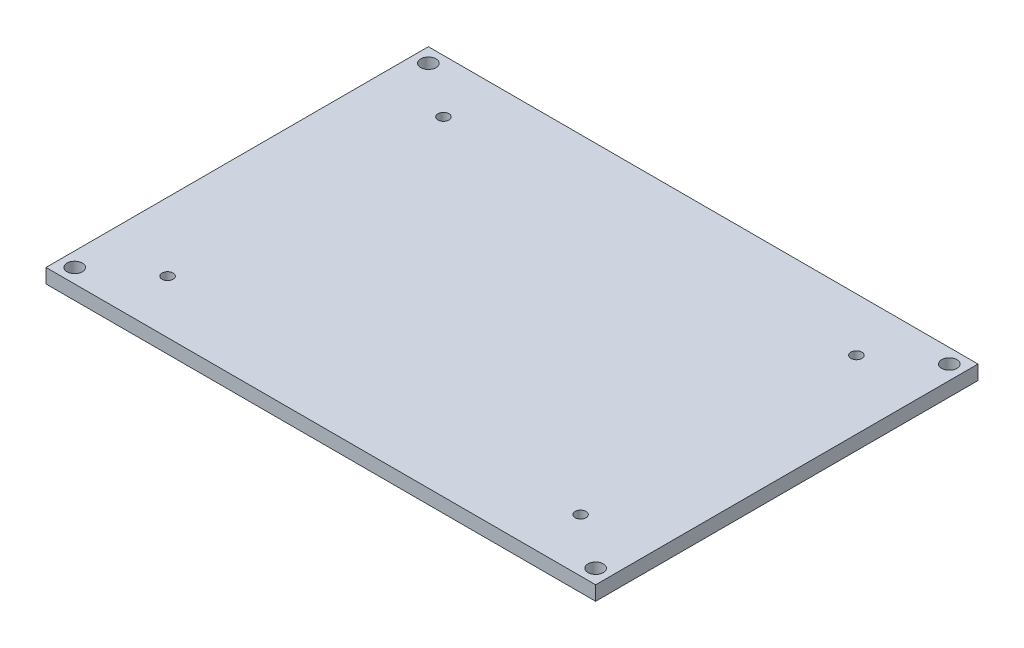
ISO-10303-21;
HEADER;
FILE_DESCRIPTION(('STEP AP214'),'2;1');
FILE_NAME('part.step','',(''),(''),'','','');
FILE_SCHEMA(('AUTOMOTIVE_DESIGN { 1 0 10303 214 1 1 1 1 }'));
ENDSEC;
DATA;
#1=APPLICATION_CONTEXT('core data for automotive mechanical design processes');
#2=APPLICATION_PROTOCOL_DEFINITION('international standard','automotive_design',2000,#1);
#3=PRODUCT_CONTEXT('',#1,'mechanical');
#4=PRODUCT('Part','Part','',(#3));
#5=PRODUCT_RELATED_PRODUCT_CATEGORY('part','',(#4));
#6=PRODUCT_DEFINITION_FORMATION('','',#4);
#7=PRODUCT_DEFINITION_CONTEXT('part definition',#1,'design');
#8=PRODUCT_DEFINITION('design','',#6,#7);
#9=PRODUCT_DEFINITION_SHAPE('','',#8);
#10=(LENGTH_UNIT() NAMED_UNIT(*) SI_UNIT(.MILLI.,.METRE.));
#11=(NAMED_UNIT(*) PLANE_ANGLE_UNIT() SI_UNIT($,.RADIAN.));
#12=(NAMED_UNIT(*) SI_UNIT($,.STERADIAN.) SOLID_ANGLE_UNIT());
#13=UNCERTAINTY_MEASURE_WITH_UNIT(LENGTH_MEASURE(1.E-05),#10,'distance_accuracy_value','');
#14=(GEOMETRIC_REPRESENTATION_CONTEXT(3) GLOBAL_UNCERTAINTY_ASSIGNED_CONTEXT((#13)) GLOBAL_UNIT_ASSIGNED_CONTEXT((#10,
#11,#12)) REPRESENTATION_CONTEXT('',''));
#15=CARTESIAN_POINT('',(0.,0.,0.));
#16=DIRECTION('',(0.,0.,1.));
#17=DIRECTION('',(1.,0.,0.));
#18=AXIS2_PLACEMENT_3D('',#15,#16,#17);
#19=CARTESIAN_POINT('',(0.,3.,0.));
#20=DIRECTION('',(0.,-1.,0.));
#21=DIRECTION('',(0.,0.,-1.));
#22=AXIS2_PLACEMENT_3D('',#19,#20,#21);
#23=PLANE('',#22);
#24=DIRECTION('',(0.,0.,-1.));
#25=VECTOR('',#24,1.);
#26=CARTESIAN_POINT('',(57.5,3.,40.));
#27=LINE('',#26,#25);
#28=CARTESIAN_POINT('',(57.5,3.,40.));
#29=VERTEX_POINT('',#28);
#30=CARTESIAN_POINT('',(57.5,3.,-40.));
#31=VERTEX_POINT('',#30);
#32=EDGE_CURVE('E85',#29,#31,#27,.T.);
#33=ORIENTED_EDGE('',*,*,#32,.T.);
#34=DIRECTION('',(-1.,0.,0.));
#35=VECTOR('',#34,1.);
#36=CARTESIAN_POINT('',(-57.5,3.,-40.));
#37=LINE('',#36,#35);
#38=CARTESIAN_POINT('',(-57.5,3.,-40.));
#39=VERTEX_POINT('',#38);
#40=EDGE_CURVE('E80',#31,#39,#37,.T.);
#41=ORIENTED_EDGE('',*,*,#40,.T.);
#42=DIRECTION('',(0.,0.,1.));
#43=VECTOR('',#42,1.);
#44=CARTESIAN_POINT('',(-57.5,3.,40.));
#45=LINE('',#44,#43);
#46=CARTESIAN_POINT('',(-57.5,3.,40.));
#47=VERTEX_POINT('',#46);
#48=EDGE_CURVE('E83',#39,#47,#45,.T.);
#49=ORIENTED_EDGE('',*,*,#48,.T.);
#50=DIRECTION('',(1.,0.,0.));
#51=VECTOR('',#50,1.);
#52=CARTESIAN_POINT('',(-57.5,3.,40.));
#53=LINE('',#52,#51);
#54=EDGE_CURVE('E50',#47,#29,#53,.T.);
#55=ORIENTED_EDGE('',*,*,#54,.T.);
#56=EDGE_LOOP('',(#33,#41,#49,#55));
#57=FACE_BOUND('',#56,.T.);
#58=CARTESIAN_POINT('',(-43.2,3.,-28.86));
#59=DIRECTION('',(0.,1.,0.));
#60=DIRECTION('',(0.,0.,1.));
#61=AXIS2_PLACEMENT_3D('',#58,#59,#60);
#62=CIRCLE('',#61,1.15);
#63=CARTESIAN_POINT('',(-43.2,3.,-27.71));
#64=VERTEX_POINT('',#63);
#65=EDGE_CURVE('E100',#64,#64,#62,.T.);
#66=ORIENTED_EDGE('',*,*,#65,.F.);
#67=EDGE_LOOP('',(#66));
#68=FACE_BOUND('',#67,.T.);
#69=CARTESIAN_POINT('',(43.2,3.,-28.86));
#70=DIRECTION('',(0.,1.,0.));
#71=DIRECTION('',(0.,0.,-1.));
#72=AXIS2_PLACEMENT_3D('',#69,#70,#71);
#73=CIRCLE('',#72,1.15000000000003);
#74=CARTESIAN_POINT('',(43.2,3.,-30.01));
#75=VERTEX_POINT('',#74);
#76=EDGE_CURVE('E115',#75,#75,#73,.T.);
#77=ORIENTED_EDGE('',*,*,#76,.F.);
#78=EDGE_LOOP('',(#77));
#79=FACE_BOUND('',#78,.T.);
#80=CARTESIAN_POINT('',(43.2,3.,28.86));
#81=DIRECTION('',(0.,1.,0.));
#82=DIRECTION('',(0.,0.,1.));
#83=AXIS2_PLACEMENT_3D('',#80,#81,#82);
#84=CIRCLE('',#83,1.1500000000001);
#85=CARTESIAN_POINT('',(43.2,3.,30.0100000000001));
#86=VERTEX_POINT('',#85);
#87=EDGE_CURVE('E121',#86,#86,#84,.T.);
#88=ORIENTED_EDGE('',*,*,#87,.F.);
#89=EDGE_LOOP('',(#88));
#90=FACE_BOUND('',#89,.T.);
#91=CARTESIAN_POINT('',(-43.2,3.,28.86));
#92=DIRECTION('',(0.,1.,0.));
#93=DIRECTION('',(0.,0.,-1.));
#94=AXIS2_PLACEMENT_3D('',#91,#92,#93);
#95=CIRCLE('',#94,1.14999999999999);
#96=CARTESIAN_POINT('',(-43.2,3.,27.71));
#97=VERTEX_POINT('',#96);
#98=EDGE_CURVE('E127',#97,#97,#95,.T.);
#99=ORIENTED_EDGE('',*,*,#98,.F.);
#100=EDGE_LOOP('',(#99));
#101=FACE_BOUND('',#100,.T.);
#102=CARTESIAN_POINT('',(-54.5,3.,-37.));
#103=DIRECTION('',(0.,1.,0.));
#104=DIRECTION('',(0.,0.,1.));
#105=AXIS2_PLACEMENT_3D('',#102,#103,#104);
#106=CIRCLE('',#105,1.6);
#107=CARTESIAN_POINT('',(-54.5,3.,-35.4));
#108=VERTEX_POINT('',#107);
#109=EDGE_CURVE('E133',#108,#108,#106,.T.);
#110=ORIENTED_EDGE('',*,*,#109,.F.);
#111=EDGE_LOOP('',(#110));
#112=FACE_BOUND('',#111,.T.);
#113=CARTESIAN_POINT('',(54.5,3.,-37.));
#114=DIRECTION('',(0.,1.,0.));
#115=DIRECTION('',(0.,0.,-1.));
#116=AXIS2_PLACEMENT_3D('',#113,#114,#115);
#117=CIRCLE('',#116,1.6);
#118=CARTESIAN_POINT('',(54.5,3.,-38.6));
#119=VERTEX_POINT('',#118);
#120=EDGE_CURVE('E139',#119,#119,#117,.T.);
#121=ORIENTED_EDGE('',*,*,#120,.F.);
#122=EDGE_LOOP('',(#121));
#123=FACE_BOUND('',#122,.T.);
#124=CARTESIAN_POINT('',(-54.5,3.,37.));
#125=DIRECTION('',(0.,1.,0.));
#126=DIRECTION('',(0.,0.,-1.));
#127=AXIS2_PLACEMENT_3D('',#124,#125,#126);
#128=CIRCLE('',#127,1.6);
#129=CARTESIAN_POINT('',(-54.5,3.,35.4));
#130=VERTEX_POINT('',#129);
#131=EDGE_CURVE('E145',#130,#130,#128,.T.);
#132=ORIENTED_EDGE('',*,*,#131,.F.);
#133=EDGE_LOOP('',(#132));
#134=FACE_BOUND('',#133,.T.);
#135=CARTESIAN_POINT('',(54.5,3.,37.));
#136=DIRECTION('',(0.,1.,0.));
#137=DIRECTION('',(0.,0.,1.));
#138=AXIS2_PLACEMENT_3D('',#135,#136,#137);
#139=CIRCLE('',#138,1.6);
#140=CARTESIAN_POINT('',(54.5,3.,38.6));
#141=VERTEX_POINT('',#140);
#142=EDGE_CURVE('E151',#141,#141,#139,.T.);
#143=ORIENTED_EDGE('',*,*,#142,.F.);
#144=EDGE_LOOP('',(#143));
#145=FACE_BOUND('',#144,.T.);
#146=ADVANCED_FACE('F33',(#57,#68,#79,#90,#101,#112,#123,#134,#145),#23,.F.);
#147=CARTESIAN_POINT('',(0.,0.,0.));
#148=DIRECTION('',(0.,-1.,0.));
#149=DIRECTION('',(0.,0.,-1.));
#150=AXIS2_PLACEMENT_3D('',#147,#148,#149);
#151=PLANE('',#150);
#152=CARTESIAN_POINT('',(-54.5,0.,37.));
#153=DIRECTION('',(0.,1.,0.));
#154=DIRECTION('',(0.,0.,-1.));
#155=AXIS2_PLACEMENT_3D('',#152,#153,#154);
#156=CIRCLE('',#155,1.6);
#157=CARTESIAN_POINT('',(-54.5,0.,35.4));
#158=VERTEX_POINT('',#157);
#159=EDGE_CURVE('E148',#158,#158,#156,.T.);
#160=ORIENTED_EDGE('',*,*,#159,.T.);
#161=EDGE_LOOP('',(#160));
#162=FACE_BOUND('',#161,.T.);
#163=CARTESIAN_POINT('',(-54.5,0.,-37.));
#164=DIRECTION('',(0.,1.,0.));
#165=DIRECTION('',(0.,0.,1.));
#166=AXIS2_PLACEMENT_3D('',#163,#164,#165);
#167=CIRCLE('',#166,1.6);
#168=CARTESIAN_POINT('',(-54.5,0.,-35.4));
#169=VERTEX_POINT('',#168);
#170=EDGE_CURVE('E136',#169,#169,#167,.T.);
#171=ORIENTED_EDGE('',*,*,#170,.T.);
#172=EDGE_LOOP('',(#171));
#173=FACE_BOUND('',#172,.T.);
#174=CARTESIAN_POINT('',(43.2,0.,28.86));
#175=DIRECTION('',(0.,1.,0.));
#176=DIRECTION('',(0.,0.,1.));
#177=AXIS2_PLACEMENT_3D('',#174,#175,#176);
#178=CIRCLE('',#177,1.1500000000001);
#179=CARTESIAN_POINT('',(43.2,0.,30.0100000000001));
#180=VERTEX_POINT('',#179);
#181=EDGE_CURVE('E124',#180,#180,#178,.T.);
#182=ORIENTED_EDGE('',*,*,#181,.T.);
#183=EDGE_LOOP('',(#182));
#184=FACE_BOUND('',#183,.T.);
#185=CARTESIAN_POINT('',(-43.2,0.,-28.86));
#186=DIRECTION('',(0.,1.,0.));
#187=DIRECTION('',(0.,0.,1.));
#188=AXIS2_PLACEMENT_3D('',#185,#186,#187);
#189=CIRCLE('',#188,1.15);
#190=CARTESIAN_POINT('',(-43.2,0.,-27.71));
#191=VERTEX_POINT('',#190);
#192=EDGE_CURVE('E112',#191,#191,#189,.T.);
#193=ORIENTED_EDGE('',*,*,#192,.T.);
#194=EDGE_LOOP('',(#193));
#195=FACE_BOUND('',#194,.T.);
#196=DIRECTION('',(0.,0.,-1.));
#197=VECTOR('',#196,1.);
#198=CARTESIAN_POINT('',(57.5,0.,40.));
#199=LINE('',#198,#197);
#200=CARTESIAN_POINT('',(57.5,0.,40.));
#201=VERTEX_POINT('',#200);
#202=CARTESIAN_POINT('',(57.5,0.,-40.));
#203=VERTEX_POINT('',#202);
#204=EDGE_CURVE('E97',#201,#203,#199,.T.);
#205=ORIENTED_EDGE('',*,*,#204,.F.);
#206=DIRECTION('',(1.,0.,0.));
#207=VECTOR('',#206,1.);
#208=CARTESIAN_POINT('',(-57.5,0.,40.));
#209=LINE('',#208,#207);
#210=CARTESIAN_POINT('',(-57.5,0.,40.));
#211=VERTEX_POINT('',#210);
#212=EDGE_CURVE('E73',#211,#201,#209,.T.);
#213=ORIENTED_EDGE('',*,*,#212,.F.);
#214=DIRECTION('',(0.,0.,1.));
#215=VECTOR('',#214,1.);
#216=CARTESIAN_POINT('',(-57.5,0.,40.));
#217=LINE('',#216,#215);
#218=CARTESIAN_POINT('',(-57.5,0.,-40.));
#219=VERTEX_POINT('',#218);
#220=EDGE_CURVE('E67',#219,#211,#217,.T.);
#221=ORIENTED_EDGE('',*,*,#220,.F.);
#222=DIRECTION('',(-1.,0.,0.));
#223=VECTOR('',#222,1.);
#224=CARTESIAN_POINT('',(-57.5,0.,-40.));
#225=LINE('',#224,#223);
#226=EDGE_CURVE('E89',#203,#219,#225,.T.);
#227=ORIENTED_EDGE('',*,*,#226,.F.);
#228=EDGE_LOOP('',(#205,#213,#221,#227));
#229=FACE_BOUND('',#228,.T.);
#230=CARTESIAN_POINT('',(43.2,0.,-28.86));
#231=DIRECTION('',(0.,1.,0.));
#232=DIRECTION('',(0.,0.,-1.));
#233=AXIS2_PLACEMENT_3D('',#230,#231,#232);
#234=CIRCLE('',#233,1.15000000000003);
#235=CARTESIAN_POINT('',(43.2,0.,-30.01));
#236=VERTEX_POINT('',#235);
#237=EDGE_CURVE('E118',#236,#236,#234,.T.);
#238=ORIENTED_EDGE('',*,*,#237,.T.);
#239=EDGE_LOOP('',(#238));
#240=FACE_BOUND('',#239,.T.);
#241=CARTESIAN_POINT('',(-43.2,0.,28.86));
#242=DIRECTION('',(0.,1.,0.));
#243=DIRECTION('',(0.,0.,-1.));
#244=AXIS2_PLACEMENT_3D('',#241,#242,#243);
#245=CIRCLE('',#244,1.14999999999999);
#246=CARTESIAN_POINT('',(-43.2,0.,27.71));
#247=VERTEX_POINT('',#246);
#248=EDGE_CURVE('E130',#247,#247,#245,.T.);
#249=ORIENTED_EDGE('',*,*,#248,.T.);
#250=EDGE_LOOP('',(#249));
#251=FACE_BOUND('',#250,.T.);
#252=CARTESIAN_POINT('',(54.5,0.,-37.));
#253=DIRECTION('',(0.,1.,0.));
#254=DIRECTION('',(0.,0.,-1.));
#255=AXIS2_PLACEMENT_3D('',#252,#253,#254);
#256=CIRCLE('',#255,1.6);
#257=CARTESIAN_POINT('',(54.5,0.,-38.6));
#258=VERTEX_POINT('',#257);
#259=EDGE_CURVE('E142',#258,#258,#256,.T.);
#260=ORIENTED_EDGE('',*,*,#259,.T.);
#261=EDGE_LOOP('',(#260));
#262=FACE_BOUND('',#261,.T.);
#263=CARTESIAN_POINT('',(54.5,0.,37.));
#264=DIRECTION('',(0.,1.,0.));
#265=DIRECTION('',(0.,0.,1.));
#266=AXIS2_PLACEMENT_3D('',#263,#264,#265);
#267=CIRCLE('',#266,1.6);
#268=CARTESIAN_POINT('',(54.5,0.,38.6));
#269=VERTEX_POINT('',#268);
#270=EDGE_CURVE('E154',#269,#269,#267,.T.);
#271=ORIENTED_EDGE('',*,*,#270,.T.);
#272=EDGE_LOOP('',(#271));
#273=FACE_BOUND('',#272,.T.);
#274=ADVANCED_FACE('F108',(#162,#173,#184,#195,#229,#240,#251,#262,#273),#151,.T.);
#275=CARTESIAN_POINT('',(57.5,3.,40.));
#276=DIRECTION('',(-1.,0.,0.));
#277=DIRECTION('',(0.,0.,1.));
#278=AXIS2_PLACEMENT_3D('',#275,#276,#277);
#279=PLANE('',#278);
#280=ORIENTED_EDGE('',*,*,#204,.T.);
#281=DIRECTION('',(0.,-1.,0.));
#282=VECTOR('',#281,1.);
#283=CARTESIAN_POINT('',(57.5,3.,-40.));
#284=LINE('',#283,#282);
#285=EDGE_CURVE('E11',#31,#203,#284,.T.);
#286=ORIENTED_EDGE('',*,*,#285,.F.);
#287=ORIENTED_EDGE('',*,*,#32,.F.);
#288=DIRECTION('',(0.,-1.,0.));
#289=VECTOR('',#288,1.);
#290=CARTESIAN_POINT('',(57.5,3.,40.));
#291=LINE('',#290,#289);
#292=EDGE_CURVE('E93',#29,#201,#291,.T.);
#293=ORIENTED_EDGE('',*,*,#292,.T.);
#294=EDGE_LOOP('',(#280,#286,#287,#293));
#295=FACE_BOUND('',#294,.T.);
#296=ADVANCED_FACE('F35',(#295),#279,.F.);
#297=CARTESIAN_POINT('',(-57.5,3.,-40.));
#298=DIRECTION('',(0.,0.,1.));
#299=DIRECTION('',(1.,0.,0.));
#300=AXIS2_PLACEMENT_3D('',#297,#298,#299);
#301=PLANE('',#300);
#302=ORIENTED_EDGE('',*,*,#226,.T.);
#303=DIRECTION('',(0.,-1.,0.));
#304=VECTOR('',#303,1.);
#305=CARTESIAN_POINT('',(-57.5,3.,-40.));
#306=LINE('',#305,#304);
#307=EDGE_CURVE('E42',#39,#219,#306,.T.);
#308=ORIENTED_EDGE('',*,*,#307,.F.);
#309=ORIENTED_EDGE('',*,*,#40,.F.);
#310=ORIENTED_EDGE('',*,*,#285,.T.);
#311=EDGE_LOOP('',(#302,#308,#309,#310));
#312=FACE_BOUND('',#311,.T.);
#313=ADVANCED_FACE('F88',(#312),#301,.F.);
#314=CARTESIAN_POINT('',(-57.5,3.,40.));
#315=DIRECTION('',(1.,0.,0.));
#316=DIRECTION('',(0.,0.,-1.));
#317=AXIS2_PLACEMENT_3D('',#314,#315,#316);
#318=PLANE('',#317);
#319=ORIENTED_EDGE('',*,*,#220,.T.);
#320=DIRECTION('',(0.,-1.,0.));
#321=VECTOR('',#320,1.);
#322=CARTESIAN_POINT('',(-57.5,3.,40.));
#323=LINE('',#322,#321);
#324=EDGE_CURVE('E90',#47,#211,#323,.T.);
#325=ORIENTED_EDGE('',*,*,#324,.F.);
#326=ORIENTED_EDGE('',*,*,#48,.F.);
#327=ORIENTED_EDGE('',*,*,#307,.T.);
#328=EDGE_LOOP('',(#319,#325,#326,#327));
#329=FACE_BOUND('',#328,.T.);
#330=ADVANCED_FACE('F91',(#329),#318,.F.);
#331=CARTESIAN_POINT('',(-57.5,3.,40.));
#332=DIRECTION('',(0.,0.,-1.));
#333=DIRECTION('',(-1.,0.,0.));
#334=AXIS2_PLACEMENT_3D('',#331,#332,#333);
#335=PLANE('',#334);
#336=ORIENTED_EDGE('',*,*,#212,.T.);
#337=ORIENTED_EDGE('',*,*,#292,.F.);
#338=ORIENTED_EDGE('',*,*,#54,.F.);
#339=ORIENTED_EDGE('',*,*,#324,.T.);
#340=EDGE_LOOP('',(#336,#337,#338,#339));
#341=FACE_BOUND('',#340,.T.);
#342=ADVANCED_FACE('F105',(#341),#335,.F.);
#343=CARTESIAN_POINT('',(-43.2,3.,-28.86));
#344=DIRECTION('',(0.,-1.,0.));
#345=DIRECTION('',(0.,0.,-1.));
#346=AXIS2_PLACEMENT_3D('',#343,#344,#345);
#347=CYLINDRICAL_SURFACE('',#346,1.15);
#348=ORIENTED_EDGE('',*,*,#65,.T.);
#349=EDGE_LOOP('',(#348));
#350=FACE_BOUND('',#349,.T.);
#351=ORIENTED_EDGE('',*,*,#192,.F.);
#352=EDGE_LOOP('',(#351));
#353=FACE_BOUND('',#352,.T.);
#354=ADVANCED_FACE('F171',(#350,#353),#347,.F.);
#355=CARTESIAN_POINT('',(43.2,3.,-28.86));
#356=DIRECTION('',(0.,-1.,0.));
#357=DIRECTION('',(0.,0.,-1.));
#358=AXIS2_PLACEMENT_3D('',#355,#356,#357);
#359=CYLINDRICAL_SURFACE('',#358,1.15000000000003);
#360=ORIENTED_EDGE('',*,*,#76,.T.);
#361=EDGE_LOOP('',(#360));
#362=FACE_BOUND('',#361,.T.);
#363=ORIENTED_EDGE('',*,*,#237,.F.);
#364=EDGE_LOOP('',(#363));
#365=FACE_BOUND('',#364,.T.);
#366=ADVANCED_FACE('F217',(#362,#365),#359,.F.);
#367=CARTESIAN_POINT('',(43.2,3.,28.86));
#368=DIRECTION('',(0.,-1.,0.));
#369=DIRECTION('',(0.,0.,-1.));
#370=AXIS2_PLACEMENT_3D('',#367,#368,#369);
#371=CYLINDRICAL_SURFACE('',#370,1.1500000000001);
#372=ORIENTED_EDGE('',*,*,#87,.T.);
#373=EDGE_LOOP('',(#372));
#374=FACE_BOUND('',#373,.T.);
#375=ORIENTED_EDGE('',*,*,#181,.F.);
#376=EDGE_LOOP('',(#375));
#377=FACE_BOUND('',#376,.T.);
#378=ADVANCED_FACE('F225',(#374,#377),#371,.F.);
#379=CARTESIAN_POINT('',(-43.2,3.,28.86));
#380=DIRECTION('',(0.,-1.,0.));
#381=DIRECTION('',(0.,0.,-1.));
#382=AXIS2_PLACEMENT_3D('',#379,#380,#381);
#383=CYLINDRICAL_SURFACE('',#382,1.14999999999999);
#384=ORIENTED_EDGE('',*,*,#98,.T.);
#385=EDGE_LOOP('',(#384));
#386=FACE_BOUND('',#385,.T.);
#387=ORIENTED_EDGE('',*,*,#248,.F.);
#388=EDGE_LOOP('',(#387));
#389=FACE_BOUND('',#388,.T.);
#390=ADVANCED_FACE('F233',(#386,#389),#383,.F.);
#391=CARTESIAN_POINT('',(-54.5,3.,-37.));
#392=DIRECTION('',(0.,-1.,0.));
#393=DIRECTION('',(0.,0.,-1.));
#394=AXIS2_PLACEMENT_3D('',#391,#392,#393);
#395=CYLINDRICAL_SURFACE('',#394,1.6);
#396=ORIENTED_EDGE('',*,*,#109,.T.);
#397=EDGE_LOOP('',(#396));
#398=FACE_BOUND('',#397,.T.);
#399=ORIENTED_EDGE('',*,*,#170,.F.);
#400=EDGE_LOOP('',(#399));
#401=FACE_BOUND('',#400,.T.);
#402=ADVANCED_FACE('F242',(#398,#401),#395,.F.);
#403=CARTESIAN_POINT('',(54.5,3.,-37.));
#404=DIRECTION('',(0.,-1.,0.));
#405=DIRECTION('',(0.,0.,-1.));
#406=AXIS2_PLACEMENT_3D('',#403,#404,#405);
#407=CYLINDRICAL_SURFACE('',#406,1.6);
#408=ORIENTED_EDGE('',*,*,#120,.T.);
#409=EDGE_LOOP('',(#408));
#410=FACE_BOUND('',#409,.T.);
#411=ORIENTED_EDGE('',*,*,#259,.F.);
#412=EDGE_LOOP('',(#411));
#413=FACE_BOUND('',#412,.T.);
#414=ADVANCED_FACE('F251',(#410,#413),#407,.F.);
#415=CARTESIAN_POINT('',(-54.5,3.,37.));
#416=DIRECTION('',(0.,-1.,0.));
#417=DIRECTION('',(0.,0.,-1.));
#418=AXIS2_PLACEMENT_3D('',#415,#416,#417);
#419=CYLINDRICAL_SURFACE('',#418,1.6);
#420=ORIENTED_EDGE('',*,*,#131,.T.);
#421=EDGE_LOOP('',(#420));
#422=FACE_BOUND('',#421,.T.);
#423=ORIENTED_EDGE('',*,*,#159,.F.);
#424=EDGE_LOOP('',(#423));
#425=FACE_BOUND('',#424,.T.);
#426=ADVANCED_FACE('F260',(#422,#425),#419,.F.);
#427=CARTESIAN_POINT('',(54.5,3.,37.));
#428=DIRECTION('',(0.,-1.,0.));
#429=DIRECTION('',(0.,0.,-1.));
#430=AXIS2_PLACEMENT_3D('',#427,#428,#429);
#431=CYLINDRICAL_SURFACE('',#430,1.6);
#432=ORIENTED_EDGE('',*,*,#142,.T.);
#433=EDGE_LOOP('',(#432));
#434=FACE_BOUND('',#433,.T.);
#435=ORIENTED_EDGE('',*,*,#270,.F.);
#436=EDGE_LOOP('',(#435));
#437=FACE_BOUND('',#436,.T.);
#438=ADVANCED_FACE('F160',(#434,#437),#431,.F.);
#439=CLOSED_SHELL('',(#146,#274,#296,#313,#330,#342,#354,#366,#378,#390,#402,#414,#426,#438));
#440=MANIFOLD_SOLID_BREP('B2',#439);
#441=ADVANCED_BREP_SHAPE_REPRESENTATION('',(#18,#440),#14);
#442=SHAPE_DEFINITION_REPRESENTATION(#9,#441);
ENDSEC;
END-ISO-10303-21;
